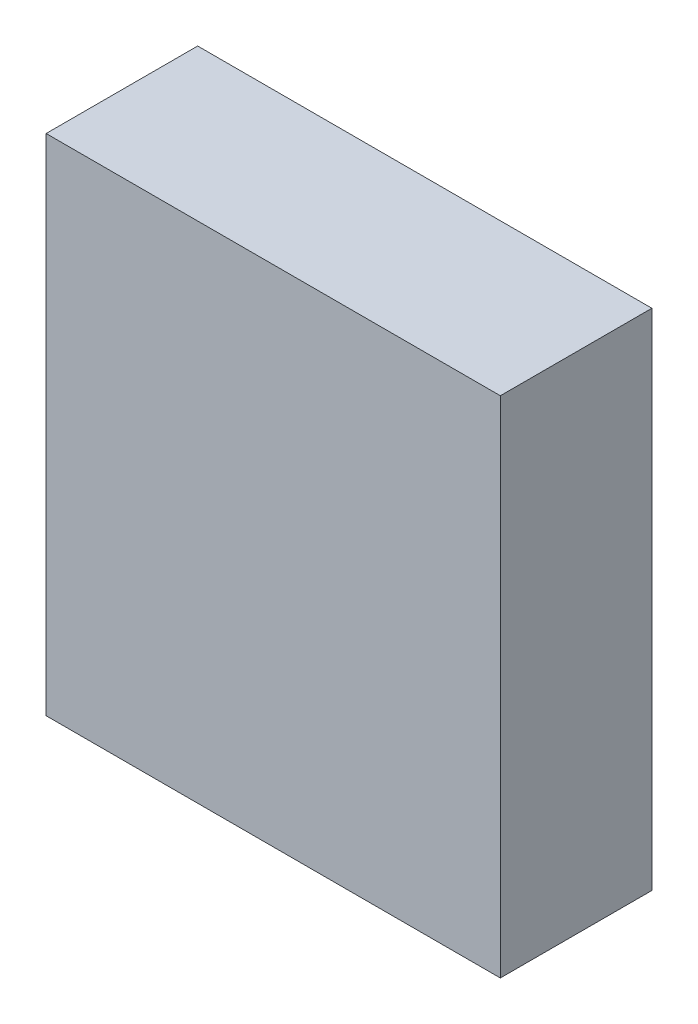
ISO-10303-21;
HEADER;
FILE_DESCRIPTION(('STEP AP214'),'2;1');
FILE_NAME('part.step','',(''),(''),'','','');
FILE_SCHEMA(('AUTOMOTIVE_DESIGN { 1 0 10303 214 1 1 1 1 }'));
ENDSEC;
DATA;
#1=APPLICATION_CONTEXT('core data for automotive mechanical design processes');
#2=APPLICATION_PROTOCOL_DEFINITION('international standard','automotive_design',2000,#1);
#3=PRODUCT_CONTEXT('',#1,'mechanical');
#4=PRODUCT('Part','Part','',(#3));
#5=PRODUCT_RELATED_PRODUCT_CATEGORY('part','',(#4));
#6=PRODUCT_DEFINITION_FORMATION('','',#4);
#7=PRODUCT_DEFINITION_CONTEXT('part definition',#1,'design');
#8=PRODUCT_DEFINITION('design','',#6,#7);
#9=PRODUCT_DEFINITION_SHAPE('','',#8);
#10=(LENGTH_UNIT() NAMED_UNIT(*) SI_UNIT(.MILLI.,.METRE.));
#11=(NAMED_UNIT(*) PLANE_ANGLE_UNIT() SI_UNIT($,.RADIAN.));
#12=(NAMED_UNIT(*) SI_UNIT($,.STERADIAN.) SOLID_ANGLE_UNIT());
#13=UNCERTAINTY_MEASURE_WITH_UNIT(LENGTH_MEASURE(1.E-05),#10,'distance_accuracy_value','');
#14=(GEOMETRIC_REPRESENTATION_CONTEXT(3) GLOBAL_UNCERTAINTY_ASSIGNED_CONTEXT((#13)) GLOBAL_UNIT_ASSIGNED_CONTEXT((#10,
#11,#12)) REPRESENTATION_CONTEXT('',''));
#15=CARTESIAN_POINT('',(0.,0.,0.));
#16=DIRECTION('',(0.,0.,1.));
#17=DIRECTION('',(1.,0.,0.));
#18=AXIS2_PLACEMENT_3D('',#15,#16,#17);
#19=CARTESIAN_POINT('',(-1.4986,-1.7018,1.));
#20=DIRECTION('',(1.,0.,0.));
#21=DIRECTION('',(0.,0.,-1.));
#22=AXIS2_PLACEMENT_3D('',#19,#20,#21);
#23=PLANE('',#22);
#24=DIRECTION('',(0.,-1.,0.));
#25=VECTOR('',#24,1.);
#26=CARTESIAN_POINT('',(-1.4986,-1.7018,0.));
#27=LINE('',#26,#25);
#28=CARTESIAN_POINT('',(-1.4986,1.6256,0.));
#29=VERTEX_POINT('',#28);
#30=CARTESIAN_POINT('',(-1.4986,-1.7018,0.));
#31=VERTEX_POINT('',#30);
#32=EDGE_CURVE('E96',#29,#31,#27,.T.);
#33=ORIENTED_EDGE('',*,*,#32,.T.);
#34=DIRECTION('',(0.,0.,-1.));
#35=VECTOR('',#34,1.);
#36=CARTESIAN_POINT('',(-1.4986,-1.7018,1.));
#37=LINE('',#36,#35);
#38=CARTESIAN_POINT('',(-1.4986,-1.7018,1.));
#39=VERTEX_POINT('',#38);
#40=EDGE_CURVE('E11',#39,#31,#37,.T.);
#41=ORIENTED_EDGE('',*,*,#40,.F.);
#42=DIRECTION('',(0.,-1.,0.));
#43=VECTOR('',#42,1.);
#44=CARTESIAN_POINT('',(-1.4986,-1.7018,1.));
#45=LINE('',#44,#43);
#46=CARTESIAN_POINT('',(-1.4986,1.6256,1.));
#47=VERTEX_POINT('',#46);
#48=EDGE_CURVE('E84',#47,#39,#45,.T.);
#49=ORIENTED_EDGE('',*,*,#48,.F.);
#50=DIRECTION('',(0.,0.,-1.));
#51=VECTOR('',#50,1.);
#52=CARTESIAN_POINT('',(-1.4986,1.6256,1.));
#53=LINE('',#52,#51);
#54=EDGE_CURVE('E92',#47,#29,#53,.T.);
#55=ORIENTED_EDGE('',*,*,#54,.T.);
#56=EDGE_LOOP('',(#33,#41,#49,#55));
#57=FACE_BOUND('',#56,.T.);
#58=ADVANCED_FACE('F33',(#57),#23,.F.);
#59=CARTESIAN_POINT('',(1.4986,-1.7018,1.));
#60=DIRECTION('',(0.,1.,0.));
#61=DIRECTION('',(0.,0.,1.));
#62=AXIS2_PLACEMENT_3D('',#59,#60,#61);
#63=PLANE('',#62);
#64=DIRECTION('',(1.,0.,0.));
#65=VECTOR('',#64,1.);
#66=CARTESIAN_POINT('',(1.4986,-1.7018,0.));
#67=LINE('',#66,#65);
#68=CARTESIAN_POINT('',(1.4986,-1.7018,0.));
#69=VERTEX_POINT('',#68);
#70=EDGE_CURVE('E88',#31,#69,#67,.T.);
#71=ORIENTED_EDGE('',*,*,#70,.T.);
#72=DIRECTION('',(0.,0.,-1.));
#73=VECTOR('',#72,1.);
#74=CARTESIAN_POINT('',(1.4986,-1.7018,1.));
#75=LINE('',#74,#73);
#76=CARTESIAN_POINT('',(1.4986,-1.7018,1.));
#77=VERTEX_POINT('',#76);
#78=EDGE_CURVE('E41',#77,#69,#75,.T.);
#79=ORIENTED_EDGE('',*,*,#78,.F.);
#80=DIRECTION('',(1.,0.,0.));
#81=VECTOR('',#80,1.);
#82=CARTESIAN_POINT('',(1.4986,-1.7018,1.));
#83=LINE('',#82,#81);
#84=EDGE_CURVE('E79',#39,#77,#83,.T.);
#85=ORIENTED_EDGE('',*,*,#84,.F.);
#86=ORIENTED_EDGE('',*,*,#40,.T.);
#87=EDGE_LOOP('',(#71,#79,#85,#86));
#88=FACE_BOUND('',#87,.T.);
#89=ADVANCED_FACE('F87',(#88),#63,.F.);
#90=CARTESIAN_POINT('',(1.4986,1.6256,1.));
#91=DIRECTION('',(-1.,0.,0.));
#92=DIRECTION('',(0.,0.,1.));
#93=AXIS2_PLACEMENT_3D('',#90,#91,#92);
#94=PLANE('',#93);
#95=DIRECTION('',(0.,1.,0.));
#96=VECTOR('',#95,1.);
#97=CARTESIAN_POINT('',(1.4986,1.6256,0.));
#98=LINE('',#97,#96);
#99=CARTESIAN_POINT('',(1.4986,1.6256,0.));
#100=VERTEX_POINT('',#99);
#101=EDGE_CURVE('E66',#69,#100,#98,.T.);
#102=ORIENTED_EDGE('',*,*,#101,.T.);
#103=DIRECTION('',(0.,0.,-1.));
#104=VECTOR('',#103,1.);
#105=CARTESIAN_POINT('',(1.4986,1.6256,1.));
#106=LINE('',#105,#104);
#107=CARTESIAN_POINT('',(1.4986,1.6256,1.));
#108=VERTEX_POINT('',#107);
#109=EDGE_CURVE('E89',#108,#100,#106,.T.);
#110=ORIENTED_EDGE('',*,*,#109,.F.);
#111=DIRECTION('',(0.,1.,0.));
#112=VECTOR('',#111,1.);
#113=CARTESIAN_POINT('',(1.4986,1.6256,1.));
#114=LINE('',#113,#112);
#115=EDGE_CURVE('E82',#77,#108,#114,.T.);
#116=ORIENTED_EDGE('',*,*,#115,.F.);
#117=ORIENTED_EDGE('',*,*,#78,.T.);
#118=EDGE_LOOP('',(#102,#110,#116,#117));
#119=FACE_BOUND('',#118,.T.);
#120=ADVANCED_FACE('F90',(#119),#94,.F.);
#121=CARTESIAN_POINT('',(-1.4986,1.6256,1.));
#122=DIRECTION('',(0.,-1.,0.));
#123=DIRECTION('',(0.,0.,-1.));
#124=AXIS2_PLACEMENT_3D('',#121,#122,#123);
#125=PLANE('',#124);
#126=DIRECTION('',(-1.,0.,0.));
#127=VECTOR('',#126,1.);
#128=CARTESIAN_POINT('',(-1.4986,1.6256,0.));
#129=LINE('',#128,#127);
#130=EDGE_CURVE('E72',#100,#29,#129,.T.);
#131=ORIENTED_EDGE('',*,*,#130,.T.);
#132=ORIENTED_EDGE('',*,*,#54,.F.);
#133=DIRECTION('',(-1.,0.,0.));
#134=VECTOR('',#133,1.);
#135=CARTESIAN_POINT('',(-1.4986,1.6256,1.));
#136=LINE('',#135,#134);
#137=EDGE_CURVE('E49',#108,#47,#136,.T.);
#138=ORIENTED_EDGE('',*,*,#137,.F.);
#139=ORIENTED_EDGE('',*,*,#109,.T.);
#140=EDGE_LOOP('',(#131,#132,#138,#139));
#141=FACE_BOUND('',#140,.T.);
#142=ADVANCED_FACE('F103',(#141),#125,.F.);
#143=CARTESIAN_POINT('',(0.,0.,1.));
#144=DIRECTION('',(0.,0.,-1.));
#145=DIRECTION('',(-1.,0.,0.));
#146=AXIS2_PLACEMENT_3D('',#143,#144,#145);
#147=PLANE('',#146);
#148=ORIENTED_EDGE('',*,*,#48,.T.);
#149=ORIENTED_EDGE('',*,*,#84,.T.);
#150=ORIENTED_EDGE('',*,*,#115,.T.);
#151=ORIENTED_EDGE('',*,*,#137,.T.);
#152=EDGE_LOOP('',(#148,#149,#150,#151));
#153=FACE_BOUND('',#152,.T.);
#154=ADVANCED_FACE('F80',(#153),#147,.F.);
#155=CARTESIAN_POINT('',(0.,0.,0.));
#156=DIRECTION('',(0.,0.,-1.));
#157=DIRECTION('',(-1.,0.,0.));
#158=AXIS2_PLACEMENT_3D('',#155,#156,#157);
#159=PLANE('',#158);
#160=ORIENTED_EDGE('',*,*,#32,.F.);
#161=ORIENTED_EDGE('',*,*,#130,.F.);
#162=ORIENTED_EDGE('',*,*,#101,.F.);
#163=ORIENTED_EDGE('',*,*,#70,.F.);
#164=EDGE_LOOP('',(#160,#161,#162,#163));
#165=FACE_BOUND('',#164,.T.);
#166=ADVANCED_FACE('F106',(#165),#159,.T.);
#167=CLOSED_SHELL('',(#58,#89,#120,#142,#154,#166));
#168=MANIFOLD_SOLID_BREP('B2',#167);
#169=ADVANCED_BREP_SHAPE_REPRESENTATION('',(#18,#168),#14);
#170=SHAPE_DEFINITION_REPRESENTATION(#9,#169);
ENDSEC;
END-ISO-10303-21;
